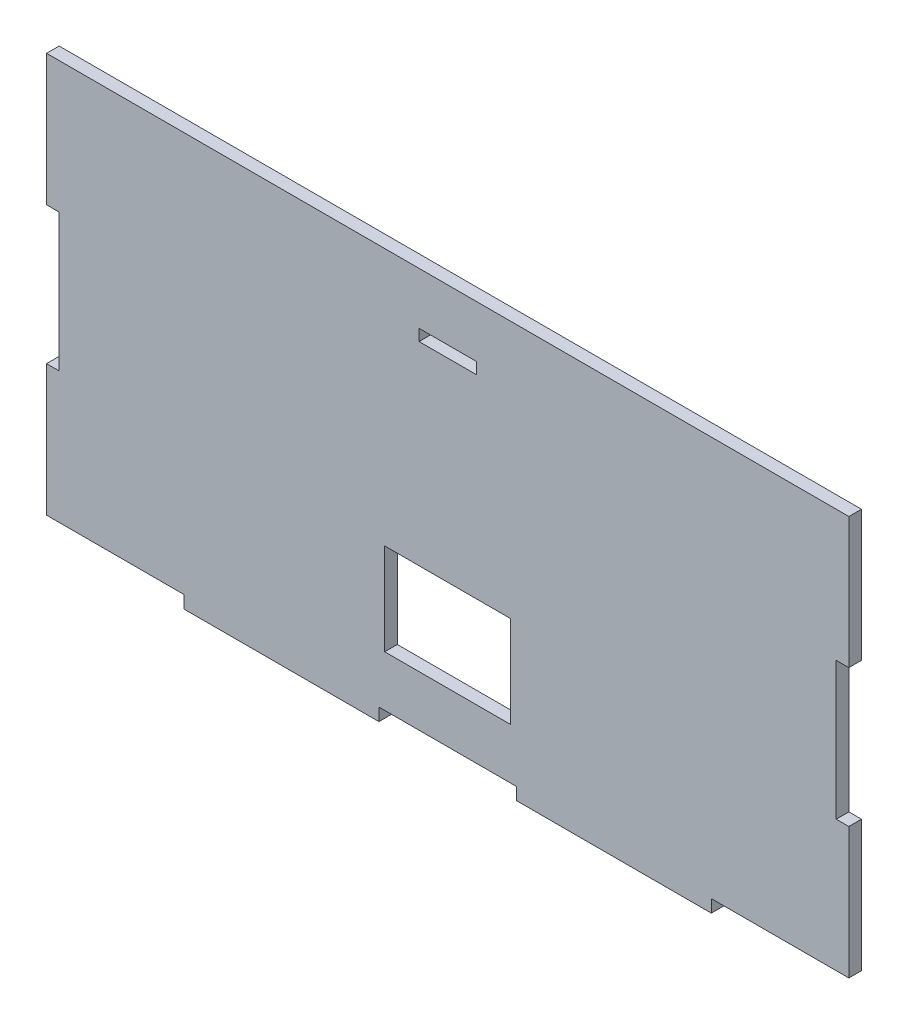
ISO-10303-21;
HEADER;
FILE_DESCRIPTION(('STEP AP214'),'2;1');
FILE_NAME('part.step','',(''),(''),'','','');
FILE_SCHEMA(('AUTOMOTIVE_DESIGN { 1 0 10303 214 1 1 1 1 }'));
ENDSEC;
DATA;
#1=APPLICATION_CONTEXT('core data for automotive mechanical design processes');
#2=APPLICATION_PROTOCOL_DEFINITION('international standard','automotive_design',2000,#1);
#3=PRODUCT_CONTEXT('',#1,'mechanical');
#4=PRODUCT('Part','Part','',(#3));
#5=PRODUCT_RELATED_PRODUCT_CATEGORY('part','',(#4));
#6=PRODUCT_DEFINITION_FORMATION('','',#4);
#7=PRODUCT_DEFINITION_CONTEXT('part definition',#1,'design');
#8=PRODUCT_DEFINITION('design','',#6,#7);
#9=PRODUCT_DEFINITION_SHAPE('','',#8);
#10=(LENGTH_UNIT() NAMED_UNIT(*) SI_UNIT(.MILLI.,.METRE.));
#11=(NAMED_UNIT(*) PLANE_ANGLE_UNIT() SI_UNIT($,.RADIAN.));
#12=(NAMED_UNIT(*) SI_UNIT($,.STERADIAN.) SOLID_ANGLE_UNIT());
#13=UNCERTAINTY_MEASURE_WITH_UNIT(LENGTH_MEASURE(1.E-05),#10,'distance_accuracy_value','');
#14=(GEOMETRIC_REPRESENTATION_CONTEXT(3) GLOBAL_UNCERTAINTY_ASSIGNED_CONTEXT((#13)) GLOBAL_UNIT_ASSIGNED_CONTEXT((#10,
#11,#12)) REPRESENTATION_CONTEXT('',''));
#15=CARTESIAN_POINT('',(0.,0.,0.));
#16=DIRECTION('',(0.,0.,1.));
#17=DIRECTION('',(1.,0.,0.));
#18=AXIS2_PLACEMENT_3D('',#15,#16,#17);
#19=CARTESIAN_POINT('',(0.,0.,5.5));
#20=DIRECTION('',(0.,0.,-1.));
#21=DIRECTION('',(-1.,0.,0.));
#22=AXIS2_PLACEMENT_3D('',#19,#20,#21);
#23=PLANE('',#22);
#24=DIRECTION('',(1.,0.,0.));
#25=VECTOR('',#24,1.);
#26=CARTESIAN_POINT('',(168.870512385704,-123.978010813617,5.5));
#27=LINE('',#26,#25);
#28=CARTESIAN_POINT('',(113.870512385705,-123.978010813617,5.5));
#29=VERTEX_POINT('',#28);
#30=CARTESIAN_POINT('',(168.870512385704,-123.978010813617,5.5));
#31=VERTEX_POINT('',#30);
#32=EDGE_CURVE('E253',#29,#31,#27,.T.);
#33=ORIENTED_EDGE('',*,*,#32,.F.);
#34=DIRECTION('',(0.,-1.,0.));
#35=VECTOR('',#34,1.);
#36=CARTESIAN_POINT('',(113.870512385705,-123.978010813617,5.5));
#37=LINE('',#36,#35);
#38=CARTESIAN_POINT('',(113.870512385705,-83.9780108136195,5.5));
#39=VERTEX_POINT('',#38);
#40=EDGE_CURVE('E261',#39,#29,#37,.T.);
#41=ORIENTED_EDGE('',*,*,#40,.F.);
#42=DIRECTION('',(-1.,0.,0.));
#43=VECTOR('',#42,1.);
#44=CARTESIAN_POINT('',(113.870512385705,-83.9780108136195,5.5));
#45=LINE('',#44,#43);
#46=CARTESIAN_POINT('',(168.870512385704,-83.9780108136195,5.5));
#47=VERTEX_POINT('',#46);
#48=EDGE_CURVE('E258',#47,#39,#45,.T.);
#49=ORIENTED_EDGE('',*,*,#48,.F.);
#50=DIRECTION('',(0.,1.,0.));
#51=VECTOR('',#50,1.);
#52=CARTESIAN_POINT('',(168.870512385704,-83.9780108136195,5.5));
#53=LINE('',#52,#51);
#54=EDGE_CURVE('E255',#31,#47,#53,.T.);
#55=ORIENTED_EDGE('',*,*,#54,.F.);
#56=EDGE_LOOP('',(#33,#41,#49,#55));
#57=FACE_BOUND('',#56,.T.);
#58=DIRECTION('',(0.,-1.,0.));
#59=VECTOR('',#58,1.);
#60=CARTESIAN_POINT('',(-33.6294876142945,28.3803960030159,5.5));
#61=LINE('',#60,#59);
#62=CARTESIAN_POINT('',(-33.6294876142945,28.3803960030159,5.5));
#63=VERTEX_POINT('',#62);
#64=CARTESIAN_POINT('',(-33.6294876142945,-28.8696039969841,5.5));
#65=VERTEX_POINT('',#64);
#66=EDGE_CURVE('E284',#63,#65,#61,.T.);
#67=ORIENTED_EDGE('',*,*,#66,.T.);
#68=DIRECTION('',(1.,0.,0.));
#69=VECTOR('',#68,1.);
#70=CARTESIAN_POINT('',(-28.1294876142952,-28.8696039969841,5.5));
#71=LINE('',#70,#69);
#72=CARTESIAN_POINT('',(-28.1294876142952,-28.8696039969841,5.5));
#73=VERTEX_POINT('',#72);
#74=EDGE_CURVE('E287',#65,#73,#71,.T.);
#75=ORIENTED_EDGE('',*,*,#74,.T.);
#76=DIRECTION('',(0.,-1.,0.));
#77=VECTOR('',#76,1.);
#78=CARTESIAN_POINT('',(-28.1294876142952,-88.8696039969841,5.5));
#79=LINE('',#78,#77);
#80=CARTESIAN_POINT('',(-28.1294876142952,-88.8696039969841,5.5));
#81=VERTEX_POINT('',#80);
#82=EDGE_CURVE('E290',#73,#81,#79,.T.);
#83=ORIENTED_EDGE('',*,*,#82,.T.);
#84=DIRECTION('',(-1.,0.,0.));
#85=VECTOR('',#84,1.);
#86=CARTESIAN_POINT('',(-33.6294876142952,-88.8696039969841,5.5));
#87=LINE('',#86,#85);
#88=CARTESIAN_POINT('',(-33.6294876142952,-88.8696039969841,5.5));
#89=VERTEX_POINT('',#88);
#90=EDGE_CURVE('E292',#81,#89,#87,.T.);
#91=ORIENTED_EDGE('',*,*,#90,.T.);
#92=DIRECTION('',(0.,-1.,0.));
#93=VECTOR('',#92,1.);
#94=CARTESIAN_POINT('',(-33.6294876142952,-88.8696039969841,5.5));
#95=LINE('',#94,#93);
#96=CARTESIAN_POINT('',(-33.6294876142952,-146.119603996984,5.5));
#97=VERTEX_POINT('',#96);
#98=EDGE_CURVE('E294',#89,#97,#95,.T.);
#99=ORIENTED_EDGE('',*,*,#98,.T.);
#100=DIRECTION('',(1.,0.,0.));
#101=VECTOR('',#100,1.);
#102=CARTESIAN_POINT('',(-33.6294876142952,-146.119603996984,5.5));
#103=LINE('',#102,#101);
#104=CARTESIAN_POINT('',(26.3705123857048,-146.119603996984,5.5));
#105=VERTEX_POINT('',#104);
#106=EDGE_CURVE('E296',#97,#105,#103,.T.);
#107=ORIENTED_EDGE('',*,*,#106,.T.);
#108=DIRECTION('',(0.,-1.,0.));
#109=VECTOR('',#108,1.);
#110=CARTESIAN_POINT('',(26.3705123857048,-146.119603996984,5.5));
#111=LINE('',#110,#109);
#112=CARTESIAN_POINT('',(26.3705123857048,-151.619603996984,5.5));
#113=VERTEX_POINT('',#112);
#114=EDGE_CURVE('E298',#105,#113,#111,.T.);
#115=ORIENTED_EDGE('',*,*,#114,.T.);
#116=DIRECTION('',(1.,0.,0.));
#117=VECTOR('',#116,1.);
#118=CARTESIAN_POINT('',(111.370512385705,-151.619603996984,5.5));
#119=LINE('',#118,#117);
#120=CARTESIAN_POINT('',(111.370512385705,-151.619603996984,5.5));
#121=VERTEX_POINT('',#120);
#122=EDGE_CURVE('E300',#113,#121,#119,.T.);
#123=ORIENTED_EDGE('',*,*,#122,.T.);
#124=DIRECTION('',(0.,1.,0.));
#125=VECTOR('',#124,1.);
#126=CARTESIAN_POINT('',(111.370512385705,-146.119603996984,5.5));
#127=LINE('',#126,#125);
#128=CARTESIAN_POINT('',(111.370512385705,-146.119603996984,5.5));
#129=VERTEX_POINT('',#128);
#130=EDGE_CURVE('E302',#121,#129,#127,.T.);
#131=ORIENTED_EDGE('',*,*,#130,.T.);
#132=DIRECTION('',(1.,0.,0.));
#133=VECTOR('',#132,1.);
#134=CARTESIAN_POINT('',(111.370512385705,-146.119603996984,5.5));
#135=LINE('',#134,#133);
#136=CARTESIAN_POINT('',(171.370512385705,-146.119603996984,5.5));
#137=VERTEX_POINT('',#136);
#138=EDGE_CURVE('E304',#129,#137,#135,.T.);
#139=ORIENTED_EDGE('',*,*,#138,.T.);
#140=DIRECTION('',(0.,-1.,0.));
#141=VECTOR('',#140,1.);
#142=CARTESIAN_POINT('',(171.370512385705,-146.119603996984,5.5));
#143=LINE('',#142,#141);
#144=CARTESIAN_POINT('',(171.370512385705,-151.476140479401,5.5));
#145=VERTEX_POINT('',#144);
#146=EDGE_CURVE('E306',#137,#145,#143,.T.);
#147=ORIENTED_EDGE('',*,*,#146,.T.);
#148=DIRECTION('',(1.,0.,0.));
#149=VECTOR('',#148,1.);
#150=CARTESIAN_POINT('',(171.370512385705,-151.476140479401,5.5));
#151=LINE('',#150,#149);
#152=CARTESIAN_POINT('',(256.370512385705,-151.476140479401,5.5));
#153=VERTEX_POINT('',#152);
#154=EDGE_CURVE('E308',#145,#153,#151,.T.);
#155=ORIENTED_EDGE('',*,*,#154,.T.);
#156=DIRECTION('',(0.,1.,0.));
#157=VECTOR('',#156,1.);
#158=CARTESIAN_POINT('',(256.370512385705,-145.976140479401,5.5));
#159=LINE('',#158,#157);
#160=CARTESIAN_POINT('',(256.370512385705,-145.976140479401,5.5));
#161=VERTEX_POINT('',#160);
#162=EDGE_CURVE('E310',#153,#161,#159,.T.);
#163=ORIENTED_EDGE('',*,*,#162,.T.);
#164=DIRECTION('',(1.,0.,0.));
#165=VECTOR('',#164,1.);
#166=CARTESIAN_POINT('',(316.370482983159,-145.976140479401,5.5));
#167=LINE('',#166,#165);
#168=CARTESIAN_POINT('',(316.370482983159,-145.976140479401,5.5));
#169=VERTEX_POINT('',#168);
#170=EDGE_CURVE('E312',#161,#169,#167,.T.);
#171=ORIENTED_EDGE('',*,*,#170,.T.);
#172=DIRECTION('',(0.,1.,0.));
#173=VECTOR('',#172,1.);
#174=CARTESIAN_POINT('',(316.370482983159,-88.7261404794007,5.5));
#175=LINE('',#174,#173);
#176=CARTESIAN_POINT('',(316.370482983159,-88.7261404794007,5.5));
#177=VERTEX_POINT('',#176);
#178=EDGE_CURVE('E314',#169,#177,#175,.T.);
#179=ORIENTED_EDGE('',*,*,#178,.T.);
#180=DIRECTION('',(-1.,0.,0.));
#181=VECTOR('',#180,1.);
#182=CARTESIAN_POINT('',(316.370482983159,-88.7261404794007,5.5));
#183=LINE('',#182,#181);
#184=CARTESIAN_POINT('',(310.870482983159,-88.7261404794007,5.5));
#185=VERTEX_POINT('',#184);
#186=EDGE_CURVE('E316',#177,#185,#183,.T.);
#187=ORIENTED_EDGE('',*,*,#186,.T.);
#188=DIRECTION('',(0.,1.,0.));
#189=VECTOR('',#188,1.);
#190=CARTESIAN_POINT('',(310.870482983159,-88.7261404794007,5.5));
#191=LINE('',#190,#189);
#192=CARTESIAN_POINT('',(310.870482983159,-28.7261404794007,5.5));
#193=VERTEX_POINT('',#192);
#194=EDGE_CURVE('E318',#185,#193,#191,.T.);
#195=ORIENTED_EDGE('',*,*,#194,.T.);
#196=DIRECTION('',(1.,0.,0.));
#197=VECTOR('',#196,1.);
#198=CARTESIAN_POINT('',(310.870482983159,-28.7261404794007,5.5));
#199=LINE('',#198,#197);
#200=CARTESIAN_POINT('',(316.370482983159,-28.7261404794007,5.5));
#201=VERTEX_POINT('',#200);
#202=EDGE_CURVE('E320',#193,#201,#199,.T.);
#203=ORIENTED_EDGE('',*,*,#202,.T.);
#204=DIRECTION('',(0.,1.,0.));
#205=VECTOR('',#204,1.);
#206=CARTESIAN_POINT('',(316.370482983159,28.3803960030159,5.5));
#207=LINE('',#206,#205);
#208=CARTESIAN_POINT('',(316.370482983159,28.3803960030159,5.5));
#209=VERTEX_POINT('',#208);
#210=EDGE_CURVE('E322',#201,#209,#207,.T.);
#211=ORIENTED_EDGE('',*,*,#210,.T.);
#212=DIRECTION('',(-1.,0.,0.));
#213=VECTOR('',#212,1.);
#214=CARTESIAN_POINT('',(-33.6294876142945,28.3803960030159,5.5));
#215=LINE('',#214,#213);
#216=EDGE_CURVE('E324',#209,#63,#215,.T.);
#217=ORIENTED_EDGE('',*,*,#216,.T.);
#218=EDGE_LOOP('',(#67,#75,#83,#91,#99,#107,#115,#123,#131,#139,#147,#155,#163,#171,#179,#187,
#195,#203,#211,#217));
#219=FACE_BOUND('',#218,.T.);
#220=DIRECTION('',(1.,0.,0.));
#221=VECTOR('',#220,1.);
#222=CARTESIAN_POINT('',(153.870512385705,0.723658366910976,5.5));
#223=LINE('',#222,#221);
#224=CARTESIAN_POINT('',(128.870512385705,0.723658366910976,5.5));
#225=VERTEX_POINT('',#224);
#226=CARTESIAN_POINT('',(153.870512385705,0.723658366910976,5.5));
#227=VERTEX_POINT('',#226);
#228=EDGE_CURVE('E217',#225,#227,#223,.T.);
#229=ORIENTED_EDGE('',*,*,#228,.F.);
#230=DIRECTION('',(0.,-1.,0.));
#231=VECTOR('',#230,1.);
#232=CARTESIAN_POINT('',(128.870512385705,0.723658366910976,5.5));
#233=LINE('',#232,#231);
#234=CARTESIAN_POINT('',(128.870512385705,5.72365836691098,5.5));
#235=VERTEX_POINT('',#234);
#236=EDGE_CURVE('E239',#235,#225,#233,.T.);
#237=ORIENTED_EDGE('',*,*,#236,.F.);
#238=DIRECTION('',(-1.,0.,0.));
#239=VECTOR('',#238,1.);
#240=CARTESIAN_POINT('',(153.870512385705,5.72365836691098,5.5));
#241=LINE('',#240,#239);
#242=CARTESIAN_POINT('',(153.870512385705,5.72365836691098,5.5));
#243=VERTEX_POINT('',#242);
#244=EDGE_CURVE('E237',#243,#235,#241,.T.);
#245=ORIENTED_EDGE('',*,*,#244,.F.);
#246=DIRECTION('',(0.,1.,0.));
#247=VECTOR('',#246,1.);
#248=CARTESIAN_POINT('',(153.870512385705,0.723658366910976,5.5));
#249=LINE('',#248,#247);
#250=EDGE_CURVE('E225',#227,#243,#249,.T.);
#251=ORIENTED_EDGE('',*,*,#250,.F.);
#252=EDGE_LOOP('',(#229,#237,#245,#251));
#253=FACE_BOUND('',#252,.T.);
#254=ADVANCED_FACE('F32',(#57,#219,#253),#23,.F.);
#255=CARTESIAN_POINT('',(0.,0.,0.));
#256=DIRECTION('',(0.,0.,-1.));
#257=DIRECTION('',(-1.,0.,0.));
#258=AXIS2_PLACEMENT_3D('',#255,#256,#257);
#259=PLANE('',#258);
#260=DIRECTION('',(0.,-1.,0.));
#261=VECTOR('',#260,1.);
#262=CARTESIAN_POINT('',(-33.6294876142945,28.3803960030159,0.));
#263=LINE('',#262,#261);
#264=CARTESIAN_POINT('',(-33.6294876142945,28.3803960030159,0.));
#265=VERTEX_POINT('',#264);
#266=CARTESIAN_POINT('',(-33.6294876142945,-28.8696039969841,0.));
#267=VERTEX_POINT('',#266);
#268=EDGE_CURVE('E283',#265,#267,#263,.T.);
#269=ORIENTED_EDGE('',*,*,#268,.F.);
#270=DIRECTION('',(-1.,0.,0.));
#271=VECTOR('',#270,1.);
#272=CARTESIAN_POINT('',(-33.6294876142945,28.3803960030159,0.));
#273=LINE('',#272,#271);
#274=CARTESIAN_POINT('',(316.370482983159,28.3803960030159,0.));
#275=VERTEX_POINT('',#274);
#276=EDGE_CURVE('E288',#275,#265,#273,.T.);
#277=ORIENTED_EDGE('',*,*,#276,.F.);
#278=DIRECTION('',(0.,1.,0.));
#279=VECTOR('',#278,1.);
#280=CARTESIAN_POINT('',(316.370482983159,28.3803960030159,0.));
#281=LINE('',#280,#279);
#282=CARTESIAN_POINT('',(316.370482983159,-28.7261404794007,0.));
#283=VERTEX_POINT('',#282);
#284=EDGE_CURVE('E363',#283,#275,#281,.T.);
#285=ORIENTED_EDGE('',*,*,#284,.F.);
#286=DIRECTION('',(1.,0.,0.));
#287=VECTOR('',#286,1.);
#288=CARTESIAN_POINT('',(310.870482983159,-28.7261404794007,0.));
#289=LINE('',#288,#287);
#290=CARTESIAN_POINT('',(310.870482983159,-28.7261404794007,0.));
#291=VERTEX_POINT('',#290);
#292=EDGE_CURVE('E361',#291,#283,#289,.T.);
#293=ORIENTED_EDGE('',*,*,#292,.F.);
#294=DIRECTION('',(0.,1.,0.));
#295=VECTOR('',#294,1.);
#296=CARTESIAN_POINT('',(310.870482983159,-88.7261404794007,0.));
#297=LINE('',#296,#295);
#298=CARTESIAN_POINT('',(310.870482983159,-88.7261404794007,0.));
#299=VERTEX_POINT('',#298);
#300=EDGE_CURVE('E359',#299,#291,#297,.T.);
#301=ORIENTED_EDGE('',*,*,#300,.F.);
#302=DIRECTION('',(-1.,0.,0.));
#303=VECTOR('',#302,1.);
#304=CARTESIAN_POINT('',(316.370482983159,-88.7261404794007,0.));
#305=LINE('',#304,#303);
#306=CARTESIAN_POINT('',(316.370482983159,-88.7261404794007,0.));
#307=VERTEX_POINT('',#306);
#308=EDGE_CURVE('E357',#307,#299,#305,.T.);
#309=ORIENTED_EDGE('',*,*,#308,.F.);
#310=DIRECTION('',(0.,1.,0.));
#311=VECTOR('',#310,1.);
#312=CARTESIAN_POINT('',(316.370482983159,-88.7261404794007,0.));
#313=LINE('',#312,#311);
#314=CARTESIAN_POINT('',(316.370482983159,-145.976140479401,0.));
#315=VERTEX_POINT('',#314);
#316=EDGE_CURVE('E355',#315,#307,#313,.T.);
#317=ORIENTED_EDGE('',*,*,#316,.F.);
#318=DIRECTION('',(1.,0.,0.));
#319=VECTOR('',#318,1.);
#320=CARTESIAN_POINT('',(316.370482983159,-145.976140479401,0.));
#321=LINE('',#320,#319);
#322=CARTESIAN_POINT('',(256.370512385705,-145.976140479401,0.));
#323=VERTEX_POINT('',#322);
#324=EDGE_CURVE('E353',#323,#315,#321,.T.);
#325=ORIENTED_EDGE('',*,*,#324,.F.);
#326=DIRECTION('',(0.,1.,0.));
#327=VECTOR('',#326,1.);
#328=CARTESIAN_POINT('',(256.370512385705,-145.976140479401,0.));
#329=LINE('',#328,#327);
#330=CARTESIAN_POINT('',(256.370512385705,-151.476140479401,0.));
#331=VERTEX_POINT('',#330);
#332=EDGE_CURVE('E351',#331,#323,#329,.T.);
#333=ORIENTED_EDGE('',*,*,#332,.F.);
#334=DIRECTION('',(1.,0.,0.));
#335=VECTOR('',#334,1.);
#336=CARTESIAN_POINT('',(171.370512385705,-151.476140479401,0.));
#337=LINE('',#336,#335);
#338=CARTESIAN_POINT('',(171.370512385705,-151.476140479401,0.));
#339=VERTEX_POINT('',#338);
#340=EDGE_CURVE('E349',#339,#331,#337,.T.);
#341=ORIENTED_EDGE('',*,*,#340,.F.);
#342=DIRECTION('',(0.,-1.,0.));
#343=VECTOR('',#342,1.);
#344=CARTESIAN_POINT('',(171.370512385705,-146.119603996984,0.));
#345=LINE('',#344,#343);
#346=CARTESIAN_POINT('',(171.370512385705,-146.119603996984,0.));
#347=VERTEX_POINT('',#346);
#348=EDGE_CURVE('E347',#347,#339,#345,.T.);
#349=ORIENTED_EDGE('',*,*,#348,.F.);
#350=DIRECTION('',(1.,0.,0.));
#351=VECTOR('',#350,1.);
#352=CARTESIAN_POINT('',(111.370512385705,-146.119603996984,0.));
#353=LINE('',#352,#351);
#354=CARTESIAN_POINT('',(111.370512385705,-146.119603996984,0.));
#355=VERTEX_POINT('',#354);
#356=EDGE_CURVE('E345',#355,#347,#353,.T.);
#357=ORIENTED_EDGE('',*,*,#356,.F.);
#358=DIRECTION('',(0.,1.,0.));
#359=VECTOR('',#358,1.);
#360=CARTESIAN_POINT('',(111.370512385705,-146.119603996984,0.));
#361=LINE('',#360,#359);
#362=CARTESIAN_POINT('',(111.370512385705,-151.619603996984,0.));
#363=VERTEX_POINT('',#362);
#364=EDGE_CURVE('E343',#363,#355,#361,.T.);
#365=ORIENTED_EDGE('',*,*,#364,.F.);
#366=DIRECTION('',(1.,0.,0.));
#367=VECTOR('',#366,1.);
#368=CARTESIAN_POINT('',(111.370512385705,-151.619603996984,0.));
#369=LINE('',#368,#367);
#370=CARTESIAN_POINT('',(26.3705123857048,-151.619603996984,0.));
#371=VERTEX_POINT('',#370);
#372=EDGE_CURVE('E341',#371,#363,#369,.T.);
#373=ORIENTED_EDGE('',*,*,#372,.F.);
#374=DIRECTION('',(0.,-1.,0.));
#375=VECTOR('',#374,1.);
#376=CARTESIAN_POINT('',(26.3705123857048,-146.119603996984,0.));
#377=LINE('',#376,#375);
#378=CARTESIAN_POINT('',(26.3705123857048,-146.119603996984,0.));
#379=VERTEX_POINT('',#378);
#380=EDGE_CURVE('E339',#379,#371,#377,.T.);
#381=ORIENTED_EDGE('',*,*,#380,.F.);
#382=DIRECTION('',(1.,0.,0.));
#383=VECTOR('',#382,1.);
#384=CARTESIAN_POINT('',(-33.6294876142952,-146.119603996984,0.));
#385=LINE('',#384,#383);
#386=CARTESIAN_POINT('',(-33.6294876142952,-146.119603996984,0.));
#387=VERTEX_POINT('',#386);
#388=EDGE_CURVE('E337',#387,#379,#385,.T.);
#389=ORIENTED_EDGE('',*,*,#388,.F.);
#390=DIRECTION('',(0.,-1.,0.));
#391=VECTOR('',#390,1.);
#392=CARTESIAN_POINT('',(-33.6294876142952,-88.8696039969841,0.));
#393=LINE('',#392,#391);
#394=CARTESIAN_POINT('',(-33.6294876142952,-88.8696039969841,0.));
#395=VERTEX_POINT('',#394);
#396=EDGE_CURVE('E335',#395,#387,#393,.T.);
#397=ORIENTED_EDGE('',*,*,#396,.F.);
#398=DIRECTION('',(-1.,0.,0.));
#399=VECTOR('',#398,1.);
#400=CARTESIAN_POINT('',(-33.6294876142952,-88.8696039969841,0.));
#401=LINE('',#400,#399);
#402=CARTESIAN_POINT('',(-28.1294876142952,-88.8696039969841,0.));
#403=VERTEX_POINT('',#402);
#404=EDGE_CURVE('E333',#403,#395,#401,.T.);
#405=ORIENTED_EDGE('',*,*,#404,.F.);
#406=DIRECTION('',(0.,-1.,0.));
#407=VECTOR('',#406,1.);
#408=CARTESIAN_POINT('',(-28.1294876142952,-88.8696039969841,0.));
#409=LINE('',#408,#407);
#410=CARTESIAN_POINT('',(-28.1294876142952,-28.8696039969841,0.));
#411=VERTEX_POINT('',#410);
#412=EDGE_CURVE('E331',#411,#403,#409,.T.);
#413=ORIENTED_EDGE('',*,*,#412,.F.);
#414=DIRECTION('',(1.,0.,0.));
#415=VECTOR('',#414,1.);
#416=CARTESIAN_POINT('',(-28.1294876142952,-28.8696039969841,0.));
#417=LINE('',#416,#415);
#418=EDGE_CURVE('E329',#267,#411,#417,.T.);
#419=ORIENTED_EDGE('',*,*,#418,.F.);
#420=EDGE_LOOP('',(#269,#277,#285,#293,#301,#309,#317,#325,#333,#341,#349,#357,#365,#373,#381,
#389,#397,#405,#413,#419));
#421=FACE_BOUND('',#420,.T.);
#422=DIRECTION('',(0.,-1.,0.));
#423=VECTOR('',#422,1.);
#424=CARTESIAN_POINT('',(113.870512385705,-123.978010813617,0.));
#425=LINE('',#424,#423);
#426=CARTESIAN_POINT('',(113.870512385705,-83.9780108136195,0.));
#427=VERTEX_POINT('',#426);
#428=CARTESIAN_POINT('',(113.870512385705,-123.978010813617,0.));
#429=VERTEX_POINT('',#428);
#430=EDGE_CURVE('E256',#427,#429,#425,.T.);
#431=ORIENTED_EDGE('',*,*,#430,.T.);
#432=DIRECTION('',(1.,0.,0.));
#433=VECTOR('',#432,1.);
#434=CARTESIAN_POINT('',(168.870512385704,-123.978010813617,0.));
#435=LINE('',#434,#433);
#436=CARTESIAN_POINT('',(168.870512385704,-123.978010813617,0.));
#437=VERTEX_POINT('',#436);
#438=EDGE_CURVE('E233',#429,#437,#435,.T.);
#439=ORIENTED_EDGE('',*,*,#438,.T.);
#440=DIRECTION('',(0.,1.,0.));
#441=VECTOR('',#440,1.);
#442=CARTESIAN_POINT('',(168.870512385704,-83.9780108136195,0.));
#443=LINE('',#442,#441);
#444=CARTESIAN_POINT('',(168.870512385704,-83.9780108136195,0.));
#445=VERTEX_POINT('',#444);
#446=EDGE_CURVE('E266',#437,#445,#443,.T.);
#447=ORIENTED_EDGE('',*,*,#446,.T.);
#448=DIRECTION('',(-1.,0.,0.));
#449=VECTOR('',#448,1.);
#450=CARTESIAN_POINT('',(113.870512385705,-83.9780108136195,0.));
#451=LINE('',#450,#449);
#452=EDGE_CURVE('E269',#445,#427,#451,.T.);
#453=ORIENTED_EDGE('',*,*,#452,.T.);
#454=EDGE_LOOP('',(#431,#439,#447,#453));
#455=FACE_BOUND('',#454,.T.);
#456=DIRECTION('',(0.,-1.,0.));
#457=VECTOR('',#456,1.);
#458=CARTESIAN_POINT('',(128.870512385705,0.723658366910976,0.));
#459=LINE('',#458,#457);
#460=CARTESIAN_POINT('',(128.870512385705,5.72365836691098,0.));
#461=VERTEX_POINT('',#460);
#462=CARTESIAN_POINT('',(128.870512385705,0.723658366910976,0.));
#463=VERTEX_POINT('',#462);
#464=EDGE_CURVE('E226',#461,#463,#459,.T.);
#465=ORIENTED_EDGE('',*,*,#464,.T.);
#466=DIRECTION('',(1.,0.,0.));
#467=VECTOR('',#466,1.);
#468=CARTESIAN_POINT('',(153.870512385705,0.723658366910976,0.));
#469=LINE('',#468,#467);
#470=CARTESIAN_POINT('',(153.870512385705,0.723658366910976,0.));
#471=VERTEX_POINT('',#470);
#472=EDGE_CURVE('E55',#463,#471,#469,.T.);
#473=ORIENTED_EDGE('',*,*,#472,.T.);
#474=DIRECTION('',(0.,1.,0.));
#475=VECTOR('',#474,1.);
#476=CARTESIAN_POINT('',(153.870512385705,0.723658366910976,0.));
#477=LINE('',#476,#475);
#478=CARTESIAN_POINT('',(153.870512385705,5.72365836691098,0.));
#479=VERTEX_POINT('',#478);
#480=EDGE_CURVE('E232',#471,#479,#477,.T.);
#481=ORIENTED_EDGE('',*,*,#480,.T.);
#482=DIRECTION('',(-1.,0.,0.));
#483=VECTOR('',#482,1.);
#484=CARTESIAN_POINT('',(153.870512385705,5.72365836691098,0.));
#485=LINE('',#484,#483);
#486=EDGE_CURVE('E245',#479,#461,#485,.T.);
#487=ORIENTED_EDGE('',*,*,#486,.T.);
#488=EDGE_LOOP('',(#465,#473,#481,#487));
#489=FACE_BOUND('',#488,.T.);
#490=ADVANCED_FACE('F429',(#421,#455,#489),#259,.T.);
#491=CARTESIAN_POINT('',(-33.6294876142945,28.3803960030159,5.5));
#492=DIRECTION('',(1.,0.,0.));
#493=DIRECTION('',(0.,1.,0.));
#494=AXIS2_PLACEMENT_3D('',#491,#492,#493);
#495=PLANE('',#494);
#496=ORIENTED_EDGE('',*,*,#268,.T.);
#497=DIRECTION('',(0.,0.,-1.));
#498=VECTOR('',#497,1.);
#499=CARTESIAN_POINT('',(-33.6294876142945,-28.8696039969841,5.5));
#500=LINE('',#499,#498);
#501=EDGE_CURVE('E11',#65,#267,#500,.T.);
#502=ORIENTED_EDGE('',*,*,#501,.F.);
#503=ORIENTED_EDGE('',*,*,#66,.F.);
#504=DIRECTION('',(0.,0.,-1.));
#505=VECTOR('',#504,1.);
#506=CARTESIAN_POINT('',(-33.6294876142945,28.3803960030159,5.5));
#507=LINE('',#506,#505);
#508=EDGE_CURVE('E326',#63,#265,#507,.T.);
#509=ORIENTED_EDGE('',*,*,#508,.T.);
#510=EDGE_LOOP('',(#496,#502,#503,#509));
#511=FACE_BOUND('',#510,.T.);
#512=ADVANCED_FACE('F34',(#511),#495,.F.);
#513=CARTESIAN_POINT('',(-28.1294876142952,-28.8696039969841,5.5));
#514=DIRECTION('',(0.,1.,0.));
#515=DIRECTION('',(0.,0.,1.));
#516=AXIS2_PLACEMENT_3D('',#513,#514,#515);
#517=PLANE('',#516);
#518=ORIENTED_EDGE('',*,*,#418,.T.);
#519=DIRECTION('',(0.,0.,-1.));
#520=VECTOR('',#519,1.);
#521=CARTESIAN_POINT('',(-28.1294876142952,-28.8696039969841,5.5));
#522=LINE('',#521,#520);
#523=EDGE_CURVE('E40',#73,#411,#522,.T.);
#524=ORIENTED_EDGE('',*,*,#523,.F.);
#525=ORIENTED_EDGE('',*,*,#74,.F.);
#526=ORIENTED_EDGE('',*,*,#501,.T.);
#527=EDGE_LOOP('',(#518,#524,#525,#526));
#528=FACE_BOUND('',#527,.T.);
#529=ADVANCED_FACE('F446',(#528),#517,.F.);
#530=CARTESIAN_POINT('',(-28.1294876142952,-88.8696039969841,5.5));
#531=DIRECTION('',(1.,0.,0.));
#532=DIRECTION('',(0.,0.,-1.));
#533=AXIS2_PLACEMENT_3D('',#530,#531,#532);
#534=PLANE('',#533);
#535=ORIENTED_EDGE('',*,*,#412,.T.);
#536=DIRECTION('',(0.,0.,-1.));
#537=VECTOR('',#536,1.);
#538=CARTESIAN_POINT('',(-28.1294876142952,-88.8696039969841,5.5));
#539=LINE('',#538,#537);
#540=EDGE_CURVE('E416',#81,#403,#539,.T.);
#541=ORIENTED_EDGE('',*,*,#540,.F.);
#542=ORIENTED_EDGE('',*,*,#82,.F.);
#543=ORIENTED_EDGE('',*,*,#523,.T.);
#544=EDGE_LOOP('',(#535,#541,#542,#543));
#545=FACE_BOUND('',#544,.T.);
#546=ADVANCED_FACE('F423',(#545),#534,.F.);
#547=CARTESIAN_POINT('',(-33.6294876142952,-88.8696039969841,5.5));
#548=DIRECTION('',(0.,-1.,0.));
#549=DIRECTION('',(0.,0.,-1.));
#550=AXIS2_PLACEMENT_3D('',#547,#548,#549);
#551=PLANE('',#550);
#552=ORIENTED_EDGE('',*,*,#404,.T.);
#553=DIRECTION('',(0.,0.,-1.));
#554=VECTOR('',#553,1.);
#555=CARTESIAN_POINT('',(-33.6294876142952,-88.8696039969841,5.5));
#556=LINE('',#555,#554);
#557=EDGE_CURVE('E413',#89,#395,#556,.T.);
#558=ORIENTED_EDGE('',*,*,#557,.F.);
#559=ORIENTED_EDGE('',*,*,#90,.F.);
#560=ORIENTED_EDGE('',*,*,#540,.T.);
#561=EDGE_LOOP('',(#552,#558,#559,#560));
#562=FACE_BOUND('',#561,.T.);
#563=ADVANCED_FACE('F435',(#562),#551,.F.);
#564=CARTESIAN_POINT('',(-33.6294876142952,-88.8696039969841,5.5));
#565=DIRECTION('',(1.,0.,0.));
#566=DIRECTION('',(0.,1.,0.));
#567=AXIS2_PLACEMENT_3D('',#564,#565,#566);
#568=PLANE('',#567);
#569=ORIENTED_EDGE('',*,*,#396,.T.);
#570=DIRECTION('',(0.,0.,-1.));
#571=VECTOR('',#570,1.);
#572=CARTESIAN_POINT('',(-33.6294876142952,-146.119603996984,5.5));
#573=LINE('',#572,#571);
#574=EDGE_CURVE('E410',#97,#387,#573,.T.);
#575=ORIENTED_EDGE('',*,*,#574,.F.);
#576=ORIENTED_EDGE('',*,*,#98,.F.);
#577=ORIENTED_EDGE('',*,*,#557,.T.);
#578=EDGE_LOOP('',(#569,#575,#576,#577));
#579=FACE_BOUND('',#578,.T.);
#580=ADVANCED_FACE('F439',(#579),#568,.F.);
#581=CARTESIAN_POINT('',(-33.6294876142952,-146.119603996984,5.5));
#582=DIRECTION('',(0.,1.,0.));
#583=DIRECTION('',(0.,0.,1.));
#584=AXIS2_PLACEMENT_3D('',#581,#582,#583);
#585=PLANE('',#584);
#586=ORIENTED_EDGE('',*,*,#388,.T.);
#587=DIRECTION('',(0.,0.,-1.));
#588=VECTOR('',#587,1.);
#589=CARTESIAN_POINT('',(26.3705123857048,-146.119603996984,5.5));
#590=LINE('',#589,#588);
#591=EDGE_CURVE('E407',#105,#379,#590,.T.);
#592=ORIENTED_EDGE('',*,*,#591,.F.);
#593=ORIENTED_EDGE('',*,*,#106,.F.);
#594=ORIENTED_EDGE('',*,*,#574,.T.);
#595=EDGE_LOOP('',(#586,#592,#593,#594));
#596=FACE_BOUND('',#595,.T.);
#597=ADVANCED_FACE('F519',(#596),#585,.F.);
#598=CARTESIAN_POINT('',(26.3705123857048,-146.119603996984,5.5));
#599=DIRECTION('',(1.,0.,0.));
#600=DIRECTION('',(0.,0.,-1.));
#601=AXIS2_PLACEMENT_3D('',#598,#599,#600);
#602=PLANE('',#601);
#603=ORIENTED_EDGE('',*,*,#380,.T.);
#604=DIRECTION('',(0.,0.,-1.));
#605=VECTOR('',#604,1.);
#606=CARTESIAN_POINT('',(26.3705123857048,-151.619603996984,5.5));
#607=LINE('',#606,#605);
#608=EDGE_CURVE('E404',#113,#371,#607,.T.);
#609=ORIENTED_EDGE('',*,*,#608,.F.);
#610=ORIENTED_EDGE('',*,*,#114,.F.);
#611=ORIENTED_EDGE('',*,*,#591,.T.);
#612=EDGE_LOOP('',(#603,#609,#610,#611));
#613=FACE_BOUND('',#612,.T.);
#614=ADVANCED_FACE('F517',(#613),#602,.F.);
#615=CARTESIAN_POINT('',(111.370512385705,-151.619603996984,5.5));
#616=DIRECTION('',(0.,1.,0.));
#617=DIRECTION('',(0.,0.,1.));
#618=AXIS2_PLACEMENT_3D('',#615,#616,#617);
#619=PLANE('',#618);
#620=ORIENTED_EDGE('',*,*,#372,.T.);
#621=DIRECTION('',(0.,0.,-1.));
#622=VECTOR('',#621,1.);
#623=CARTESIAN_POINT('',(111.370512385705,-151.619603996984,5.5));
#624=LINE('',#623,#622);
#625=EDGE_CURVE('E401',#121,#363,#624,.T.);
#626=ORIENTED_EDGE('',*,*,#625,.F.);
#627=ORIENTED_EDGE('',*,*,#122,.F.);
#628=ORIENTED_EDGE('',*,*,#608,.T.);
#629=EDGE_LOOP('',(#620,#626,#627,#628));
#630=FACE_BOUND('',#629,.T.);
#631=ADVANCED_FACE('F512',(#630),#619,.F.);
#632=CARTESIAN_POINT('',(111.370512385705,-146.119603996984,5.5));
#633=DIRECTION('',(-1.,0.,0.));
#634=DIRECTION('',(0.,0.,1.));
#635=AXIS2_PLACEMENT_3D('',#632,#633,#634);
#636=PLANE('',#635);
#637=ORIENTED_EDGE('',*,*,#364,.T.);
#638=DIRECTION('',(0.,0.,-1.));
#639=VECTOR('',#638,1.);
#640=CARTESIAN_POINT('',(111.370512385705,-146.119603996984,5.5));
#641=LINE('',#640,#639);
#642=EDGE_CURVE('E398',#129,#355,#641,.T.);
#643=ORIENTED_EDGE('',*,*,#642,.F.);
#644=ORIENTED_EDGE('',*,*,#130,.F.);
#645=ORIENTED_EDGE('',*,*,#625,.T.);
#646=EDGE_LOOP('',(#637,#643,#644,#645));
#647=FACE_BOUND('',#646,.T.);
#648=ADVANCED_FACE('F507',(#647),#636,.F.);
#649=CARTESIAN_POINT('',(111.370512385705,-146.119603996984,5.5));
#650=DIRECTION('',(0.,1.,0.));
#651=DIRECTION('',(0.,0.,1.));
#652=AXIS2_PLACEMENT_3D('',#649,#650,#651);
#653=PLANE('',#652);
#654=ORIENTED_EDGE('',*,*,#356,.T.);
#655=DIRECTION('',(0.,0.,-1.));
#656=VECTOR('',#655,1.);
#657=CARTESIAN_POINT('',(171.370512385705,-146.119603996984,5.5));
#658=LINE('',#657,#656);
#659=EDGE_CURVE('E395',#137,#347,#658,.T.);
#660=ORIENTED_EDGE('',*,*,#659,.F.);
#661=ORIENTED_EDGE('',*,*,#138,.F.);
#662=ORIENTED_EDGE('',*,*,#642,.T.);
#663=EDGE_LOOP('',(#654,#660,#661,#662));
#664=FACE_BOUND('',#663,.T.);
#665=ADVANCED_FACE('F503',(#664),#653,.F.);
#666=CARTESIAN_POINT('',(171.370512385705,-146.119603996984,5.5));
#667=DIRECTION('',(1.,0.,0.));
#668=DIRECTION('',(0.,0.,-1.));
#669=AXIS2_PLACEMENT_3D('',#666,#667,#668);
#670=PLANE('',#669);
#671=ORIENTED_EDGE('',*,*,#348,.T.);
#672=DIRECTION('',(0.,0.,-1.));
#673=VECTOR('',#672,1.);
#674=CARTESIAN_POINT('',(171.370512385705,-151.476140479401,5.5));
#675=LINE('',#674,#673);
#676=EDGE_CURVE('E392',#145,#339,#675,.T.);
#677=ORIENTED_EDGE('',*,*,#676,.F.);
#678=ORIENTED_EDGE('',*,*,#146,.F.);
#679=ORIENTED_EDGE('',*,*,#659,.T.);
#680=EDGE_LOOP('',(#671,#677,#678,#679));
#681=FACE_BOUND('',#680,.T.);
#682=ADVANCED_FACE('F498',(#681),#670,.F.);
#683=CARTESIAN_POINT('',(171.370512385705,-151.476140479401,5.5));
#684=DIRECTION('',(0.,1.,0.));
#685=DIRECTION('',(0.,0.,1.));
#686=AXIS2_PLACEMENT_3D('',#683,#684,#685);
#687=PLANE('',#686);
#688=ORIENTED_EDGE('',*,*,#340,.T.);
#689=DIRECTION('',(0.,0.,-1.));
#690=VECTOR('',#689,1.);
#691=CARTESIAN_POINT('',(256.370512385705,-151.476140479401,5.5));
#692=LINE('',#691,#690);
#693=EDGE_CURVE('E389',#153,#331,#692,.T.);
#694=ORIENTED_EDGE('',*,*,#693,.F.);
#695=ORIENTED_EDGE('',*,*,#154,.F.);
#696=ORIENTED_EDGE('',*,*,#676,.T.);
#697=EDGE_LOOP('',(#688,#694,#695,#696));
#698=FACE_BOUND('',#697,.T.);
#699=ADVANCED_FACE('F492',(#698),#687,.F.);
#700=CARTESIAN_POINT('',(256.370512385705,-145.976140479401,5.5));
#701=DIRECTION('',(-1.,0.,0.));
#702=DIRECTION('',(0.,0.,1.));
#703=AXIS2_PLACEMENT_3D('',#700,#701,#702);
#704=PLANE('',#703);
#705=ORIENTED_EDGE('',*,*,#332,.T.);
#706=DIRECTION('',(0.,0.,-1.));
#707=VECTOR('',#706,1.);
#708=CARTESIAN_POINT('',(256.370512385705,-145.976140479401,5.5));
#709=LINE('',#708,#707);
#710=EDGE_CURVE('E386',#161,#323,#709,.T.);
#711=ORIENTED_EDGE('',*,*,#710,.F.);
#712=ORIENTED_EDGE('',*,*,#162,.F.);
#713=ORIENTED_EDGE('',*,*,#693,.T.);
#714=EDGE_LOOP('',(#705,#711,#712,#713));
#715=FACE_BOUND('',#714,.T.);
#716=ADVANCED_FACE('F488',(#715),#704,.F.);
#717=CARTESIAN_POINT('',(316.370482983159,-145.976140479401,5.5));
#718=DIRECTION('',(0.,1.,0.));
#719=DIRECTION('',(-1.,0.,0.));
#720=AXIS2_PLACEMENT_3D('',#717,#718,#719);
#721=PLANE('',#720);
#722=ORIENTED_EDGE('',*,*,#324,.T.);
#723=DIRECTION('',(0.,0.,-1.));
#724=VECTOR('',#723,1.);
#725=CARTESIAN_POINT('',(316.370482983159,-145.976140479401,5.5));
#726=LINE('',#725,#724);
#727=EDGE_CURVE('E383',#169,#315,#726,.T.);
#728=ORIENTED_EDGE('',*,*,#727,.F.);
#729=ORIENTED_EDGE('',*,*,#170,.F.);
#730=ORIENTED_EDGE('',*,*,#710,.T.);
#731=EDGE_LOOP('',(#722,#728,#729,#730));
#732=FACE_BOUND('',#731,.T.);
#733=ADVANCED_FACE('F483',(#732),#721,.F.);
#734=CARTESIAN_POINT('',(316.370482983159,-88.7261404794007,5.5));
#735=DIRECTION('',(-1.,0.,0.));
#736=DIRECTION('',(0.,-1.,0.));
#737=AXIS2_PLACEMENT_3D('',#734,#735,#736);
#738=PLANE('',#737);
#739=ORIENTED_EDGE('',*,*,#316,.T.);
#740=DIRECTION('',(0.,0.,-1.));
#741=VECTOR('',#740,1.);
#742=CARTESIAN_POINT('',(316.370482983159,-88.7261404794007,5.5));
#743=LINE('',#742,#741);
#744=EDGE_CURVE('E380',#177,#307,#743,.T.);
#745=ORIENTED_EDGE('',*,*,#744,.F.);
#746=ORIENTED_EDGE('',*,*,#178,.F.);
#747=ORIENTED_EDGE('',*,*,#727,.T.);
#748=EDGE_LOOP('',(#739,#745,#746,#747));
#749=FACE_BOUND('',#748,.T.);
#750=ADVANCED_FACE('F477',(#749),#738,.F.);
#751=CARTESIAN_POINT('',(316.370482983159,-88.7261404794007,5.5));
#752=DIRECTION('',(0.,-1.,0.));
#753=DIRECTION('',(0.,0.,-1.));
#754=AXIS2_PLACEMENT_3D('',#751,#752,#753);
#755=PLANE('',#754);
#756=ORIENTED_EDGE('',*,*,#308,.T.);
#757=DIRECTION('',(0.,0.,-1.));
#758=VECTOR('',#757,1.);
#759=CARTESIAN_POINT('',(310.870482983159,-88.7261404794007,5.5));
#760=LINE('',#759,#758);
#761=EDGE_CURVE('E377',#185,#299,#760,.T.);
#762=ORIENTED_EDGE('',*,*,#761,.F.);
#763=ORIENTED_EDGE('',*,*,#186,.F.);
#764=ORIENTED_EDGE('',*,*,#744,.T.);
#765=EDGE_LOOP('',(#756,#762,#763,#764));
#766=FACE_BOUND('',#765,.T.);
#767=ADVANCED_FACE('F473',(#766),#755,.F.);
#768=CARTESIAN_POINT('',(310.870482983159,-88.7261404794007,5.5));
#769=DIRECTION('',(-1.,0.,0.));
#770=DIRECTION('',(0.,0.,1.));
#771=AXIS2_PLACEMENT_3D('',#768,#769,#770);
#772=PLANE('',#771);
#773=ORIENTED_EDGE('',*,*,#300,.T.);
#774=DIRECTION('',(0.,0.,-1.));
#775=VECTOR('',#774,1.);
#776=CARTESIAN_POINT('',(310.870482983159,-28.7261404794007,5.5));
#777=LINE('',#776,#775);
#778=EDGE_CURVE('E374',#193,#291,#777,.T.);
#779=ORIENTED_EDGE('',*,*,#778,.F.);
#780=ORIENTED_EDGE('',*,*,#194,.F.);
#781=ORIENTED_EDGE('',*,*,#761,.T.);
#782=EDGE_LOOP('',(#773,#779,#780,#781));
#783=FACE_BOUND('',#782,.T.);
#784=ADVANCED_FACE('F468',(#783),#772,.F.);
#785=CARTESIAN_POINT('',(310.870482983159,-28.7261404794007,5.5));
#786=DIRECTION('',(0.,1.,0.));
#787=DIRECTION('',(0.,0.,1.));
#788=AXIS2_PLACEMENT_3D('',#785,#786,#787);
#789=PLANE('',#788);
#790=ORIENTED_EDGE('',*,*,#292,.T.);
#791=DIRECTION('',(0.,0.,-1.));
#792=VECTOR('',#791,1.);
#793=CARTESIAN_POINT('',(316.370482983159,-28.7261404794007,5.5));
#794=LINE('',#793,#792);
#795=EDGE_CURVE('E371',#201,#283,#794,.T.);
#796=ORIENTED_EDGE('',*,*,#795,.F.);
#797=ORIENTED_EDGE('',*,*,#202,.F.);
#798=ORIENTED_EDGE('',*,*,#778,.T.);
#799=EDGE_LOOP('',(#790,#796,#797,#798));
#800=FACE_BOUND('',#799,.T.);
#801=ADVANCED_FACE('F462',(#800),#789,.F.);
#802=CARTESIAN_POINT('',(316.370482983159,28.3803960030159,5.5));
#803=DIRECTION('',(-1.,0.,0.));
#804=DIRECTION('',(0.,0.,1.));
#805=AXIS2_PLACEMENT_3D('',#802,#803,#804);
#806=PLANE('',#805);
#807=ORIENTED_EDGE('',*,*,#284,.T.);
#808=DIRECTION('',(0.,0.,-1.));
#809=VECTOR('',#808,1.);
#810=CARTESIAN_POINT('',(316.370482983159,28.3803960030159,5.5));
#811=LINE('',#810,#809);
#812=EDGE_CURVE('E368',#209,#275,#811,.T.);
#813=ORIENTED_EDGE('',*,*,#812,.F.);
#814=ORIENTED_EDGE('',*,*,#210,.F.);
#815=ORIENTED_EDGE('',*,*,#795,.T.);
#816=EDGE_LOOP('',(#807,#813,#814,#815));
#817=FACE_BOUND('',#816,.T.);
#818=ADVANCED_FACE('F458',(#817),#806,.F.);
#819=CARTESIAN_POINT('',(-33.6294876142945,28.3803960030159,5.5));
#820=DIRECTION('',(0.,-1.,0.));
#821=DIRECTION('',(0.,0.,-1.));
#822=AXIS2_PLACEMENT_3D('',#819,#820,#821);
#823=PLANE('',#822);
#824=ORIENTED_EDGE('',*,*,#276,.T.);
#825=ORIENTED_EDGE('',*,*,#508,.F.);
#826=ORIENTED_EDGE('',*,*,#216,.F.);
#827=ORIENTED_EDGE('',*,*,#812,.T.);
#828=EDGE_LOOP('',(#824,#825,#826,#827));
#829=FACE_BOUND('',#828,.T.);
#830=ADVANCED_FACE('F453',(#829),#823,.F.);
#831=CARTESIAN_POINT('',(168.870512385704,-123.978010813617,5.5));
#832=DIRECTION('',(0.,1.,0.));
#833=DIRECTION('',(0.,0.,1.));
#834=AXIS2_PLACEMENT_3D('',#831,#832,#833);
#835=PLANE('',#834);
#836=ORIENTED_EDGE('',*,*,#438,.F.);
#837=DIRECTION('',(0.,0.,-1.));
#838=VECTOR('',#837,1.);
#839=CARTESIAN_POINT('',(113.870512385705,-123.978010813617,5.5));
#840=LINE('',#839,#838);
#841=EDGE_CURVE('E263',#29,#429,#840,.T.);
#842=ORIENTED_EDGE('',*,*,#841,.F.);
#843=ORIENTED_EDGE('',*,*,#32,.T.);
#844=DIRECTION('',(0.,0.,-1.));
#845=VECTOR('',#844,1.);
#846=CARTESIAN_POINT('',(168.870512385704,-123.978010813617,5.5));
#847=LINE('',#846,#845);
#848=EDGE_CURVE('E280',#31,#437,#847,.T.);
#849=ORIENTED_EDGE('',*,*,#848,.T.);
#850=EDGE_LOOP('',(#836,#842,#843,#849));
#851=FACE_BOUND('',#850,.T.);
#852=ADVANCED_FACE('F537',(#851),#835,.T.);
#853=CARTESIAN_POINT('',(168.870512385704,-83.9780108136195,5.5));
#854=DIRECTION('',(-1.,0.,0.));
#855=DIRECTION('',(0.,0.,1.));
#856=AXIS2_PLACEMENT_3D('',#853,#854,#855);
#857=PLANE('',#856);
#858=ORIENTED_EDGE('',*,*,#446,.F.);
#859=ORIENTED_EDGE('',*,*,#848,.F.);
#860=ORIENTED_EDGE('',*,*,#54,.T.);
#861=DIRECTION('',(0.,0.,-1.));
#862=VECTOR('',#861,1.);
#863=CARTESIAN_POINT('',(168.870512385704,-83.9780108136195,5.5));
#864=LINE('',#863,#862);
#865=EDGE_CURVE('E278',#47,#445,#864,.T.);
#866=ORIENTED_EDGE('',*,*,#865,.T.);
#867=EDGE_LOOP('',(#858,#859,#860,#866));
#868=FACE_BOUND('',#867,.T.);
#869=ADVANCED_FACE('F623',(#868),#857,.T.);
#870=CARTESIAN_POINT('',(113.870512385705,-83.9780108136195,5.5));
#871=DIRECTION('',(0.,-1.,0.));
#872=DIRECTION('',(0.,0.,-1.));
#873=AXIS2_PLACEMENT_3D('',#870,#871,#872);
#874=PLANE('',#873);
#875=ORIENTED_EDGE('',*,*,#452,.F.);
#876=ORIENTED_EDGE('',*,*,#865,.F.);
#877=ORIENTED_EDGE('',*,*,#48,.T.);
#878=DIRECTION('',(0.,0.,-1.));
#879=VECTOR('',#878,1.);
#880=CARTESIAN_POINT('',(113.870512385705,-83.9780108136195,5.5));
#881=LINE('',#880,#879);
#882=EDGE_CURVE('E276',#39,#427,#881,.T.);
#883=ORIENTED_EDGE('',*,*,#882,.T.);
#884=EDGE_LOOP('',(#875,#876,#877,#883));
#885=FACE_BOUND('',#884,.T.);
#886=ADVANCED_FACE('F630',(#885),#874,.T.);
#887=CARTESIAN_POINT('',(113.870512385705,-123.978010813617,5.5));
#888=DIRECTION('',(1.,0.,0.));
#889=DIRECTION('',(0.,0.,-1.));
#890=AXIS2_PLACEMENT_3D('',#887,#888,#889);
#891=PLANE('',#890);
#892=ORIENTED_EDGE('',*,*,#430,.F.);
#893=ORIENTED_EDGE('',*,*,#882,.F.);
#894=ORIENTED_EDGE('',*,*,#40,.T.);
#895=ORIENTED_EDGE('',*,*,#841,.T.);
#896=EDGE_LOOP('',(#892,#893,#894,#895));
#897=FACE_BOUND('',#896,.T.);
#898=ADVANCED_FACE('F637',(#897),#891,.T.);
#899=CARTESIAN_POINT('',(153.870512385705,0.723658366910976,5.5));
#900=DIRECTION('',(0.,1.,0.));
#901=DIRECTION('',(0.,0.,1.));
#902=AXIS2_PLACEMENT_3D('',#899,#900,#901);
#903=PLANE('',#902);
#904=ORIENTED_EDGE('',*,*,#472,.F.);
#905=DIRECTION('',(0.,0.,-1.));
#906=VECTOR('',#905,1.);
#907=CARTESIAN_POINT('',(128.870512385705,0.723658366910976,5.5));
#908=LINE('',#907,#906);
#909=EDGE_CURVE('E221',#225,#463,#908,.T.);
#910=ORIENTED_EDGE('',*,*,#909,.F.);
#911=ORIENTED_EDGE('',*,*,#228,.T.);
#912=DIRECTION('',(0.,0.,-1.));
#913=VECTOR('',#912,1.);
#914=CARTESIAN_POINT('',(153.870512385705,0.723658366910976,5.5));
#915=LINE('',#914,#913);
#916=EDGE_CURVE('E220',#227,#471,#915,.T.);
#917=ORIENTED_EDGE('',*,*,#916,.T.);
#918=EDGE_LOOP('',(#904,#910,#911,#917));
#919=FACE_BOUND('',#918,.T.);
#920=ADVANCED_FACE('F219',(#919),#903,.T.);
#921=CARTESIAN_POINT('',(153.870512385705,0.723658366910976,5.5));
#922=DIRECTION('',(-1.,0.,0.));
#923=DIRECTION('',(0.,0.,1.));
#924=AXIS2_PLACEMENT_3D('',#921,#922,#923);
#925=PLANE('',#924);
#926=ORIENTED_EDGE('',*,*,#480,.F.);
#927=ORIENTED_EDGE('',*,*,#916,.F.);
#928=ORIENTED_EDGE('',*,*,#250,.T.);
#929=DIRECTION('',(0.,0.,-1.));
#930=VECTOR('',#929,1.);
#931=CARTESIAN_POINT('',(153.870512385705,5.72365836691098,5.5));
#932=LINE('',#931,#930);
#933=EDGE_CURVE('E234',#243,#479,#932,.T.);
#934=ORIENTED_EDGE('',*,*,#933,.T.);
#935=EDGE_LOOP('',(#926,#927,#928,#934));
#936=FACE_BOUND('',#935,.T.);
#937=ADVANCED_FACE('F229',(#936),#925,.T.);
#938=CARTESIAN_POINT('',(153.870512385705,5.72365836691098,5.5));
#939=DIRECTION('',(0.,-1.,0.));
#940=DIRECTION('',(0.,0.,-1.));
#941=AXIS2_PLACEMENT_3D('',#938,#939,#940);
#942=PLANE('',#941);
#943=ORIENTED_EDGE('',*,*,#486,.F.);
#944=ORIENTED_EDGE('',*,*,#933,.F.);
#945=ORIENTED_EDGE('',*,*,#244,.T.);
#946=DIRECTION('',(0.,0.,-1.));
#947=VECTOR('',#946,1.);
#948=CARTESIAN_POINT('',(128.870512385705,5.72365836691098,5.5));
#949=LINE('',#948,#947);
#950=EDGE_CURVE('E47',#235,#461,#949,.T.);
#951=ORIENTED_EDGE('',*,*,#950,.T.);
#952=EDGE_LOOP('',(#943,#944,#945,#951));
#953=FACE_BOUND('',#952,.T.);
#954=ADVANCED_FACE('F658',(#953),#942,.T.);
#955=CARTESIAN_POINT('',(128.870512385705,0.723658366910976,5.5));
#956=DIRECTION('',(1.,0.,0.));
#957=DIRECTION('',(0.,0.,-1.));
#958=AXIS2_PLACEMENT_3D('',#955,#956,#957);
#959=PLANE('',#958);
#960=ORIENTED_EDGE('',*,*,#464,.F.);
#961=ORIENTED_EDGE('',*,*,#950,.F.);
#962=ORIENTED_EDGE('',*,*,#236,.T.);
#963=ORIENTED_EDGE('',*,*,#909,.T.);
#964=EDGE_LOOP('',(#960,#961,#962,#963));
#965=FACE_BOUND('',#964,.T.);
#966=ADVANCED_FACE('F665',(#965),#959,.T.);
#967=CLOSED_SHELL('',(#254,#490,#512,#529,#546,#563,#580,#597,#614,#631,#648,#665,#682,#699,
#716,#733,#750,#767,#784,#801,#818,#830,#852,#869,#886,#898,#920,#937,#954,#966));
#968=MANIFOLD_SOLID_BREP('B2',#967);
#969=ADVANCED_BREP_SHAPE_REPRESENTATION('',(#18,#968),#14);
#970=SHAPE_DEFINITION_REPRESENTATION(#9,#969);
ENDSEC;
END-ISO-10303-21;
